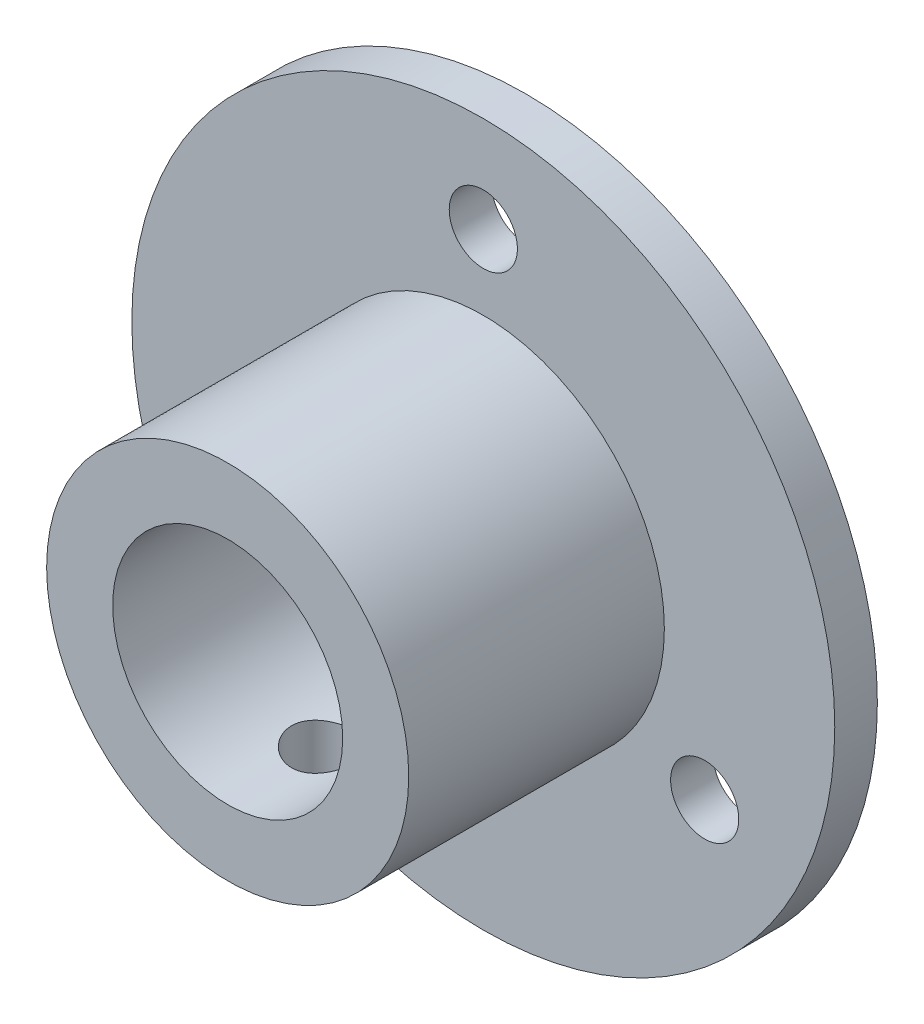
ISO-10303-21;
HEADER;
FILE_DESCRIPTION(('STEP AP214'),'2;1');
FILE_NAME('part.step','',(''),(''),'','','');
FILE_SCHEMA(('AUTOMOTIVE_DESIGN { 1 0 10303 214 1 1 1 1 }'));
ENDSEC;
DATA;
#1=APPLICATION_CONTEXT('core data for automotive mechanical design processes');
#2=APPLICATION_PROTOCOL_DEFINITION('international standard','automotive_design',2000,#1);
#3=PRODUCT_CONTEXT('',#1,'mechanical');
#4=PRODUCT('Part','Part','',(#3));
#5=PRODUCT_RELATED_PRODUCT_CATEGORY('part','',(#4));
#6=PRODUCT_DEFINITION_FORMATION('','',#4);
#7=PRODUCT_DEFINITION_CONTEXT('part definition',#1,'design');
#8=PRODUCT_DEFINITION('design','',#6,#7);
#9=PRODUCT_DEFINITION_SHAPE('','',#8);
#10=(LENGTH_UNIT() NAMED_UNIT(*) SI_UNIT(.MILLI.,.METRE.));
#11=(NAMED_UNIT(*) PLANE_ANGLE_UNIT() SI_UNIT($,.RADIAN.));
#12=(NAMED_UNIT(*) SI_UNIT($,.STERADIAN.) SOLID_ANGLE_UNIT());
#13=UNCERTAINTY_MEASURE_WITH_UNIT(LENGTH_MEASURE(1.E-05),#10,'distance_accuracy_value','');
#14=(GEOMETRIC_REPRESENTATION_CONTEXT(3) GLOBAL_UNCERTAINTY_ASSIGNED_CONTEXT((#13)) GLOBAL_UNIT_ASSIGNED_CONTEXT((#10,
#11,#12)) REPRESENTATION_CONTEXT('',''));
#15=CARTESIAN_POINT('',(0.,0.,0.));
#16=DIRECTION('',(0.,0.,1.));
#17=DIRECTION('',(1.,0.,0.));
#18=AXIS2_PLACEMENT_3D('',#15,#16,#17);
#19=CARTESIAN_POINT('',(0.,0.,2.));
#20=DIRECTION('',(0.,0.,1.));
#21=DIRECTION('',(1.,0.,0.));
#22=AXIS2_PLACEMENT_3D('',#19,#20,#21);
#23=PLANE('',#22);
#24=CARTESIAN_POINT('',(10.3923048454128,-6.0000000000003,2.));
#25=DIRECTION('',(0.,0.,1.));
#26=DIRECTION('',(1.,0.,0.));
#27=AXIS2_PLACEMENT_3D('',#24,#25,#26);
#28=CIRCLE('',#27,1.60000000000068);
#29=CARTESIAN_POINT('',(8.79230484541207,-6.0000000000003,1.99999999999999));
#30=VERTEX_POINT('',#29);
#31=EDGE_CURVE('E74',#30,#30,#28,.T.);
#32=ORIENTED_EDGE('',*,*,#31,.F.);
#33=EDGE_LOOP('',(#32));
#34=FACE_BOUND('',#33,.T.);
#35=CARTESIAN_POINT('',(-10.3923048454138,-5.9999999999997,2.));
#36=DIRECTION('',(0.,0.,1.));
#37=DIRECTION('',(1.,0.,0.));
#38=AXIS2_PLACEMENT_3D('',#35,#36,#37);
#39=CIRCLE('',#38,1.60000000000047);
#40=CARTESIAN_POINT('',(-11.9923048454142,-5.9999999999997,1.99999999999999));
#41=VERTEX_POINT('',#40);
#42=EDGE_CURVE('E68',#41,#41,#39,.T.);
#43=ORIENTED_EDGE('',*,*,#42,.F.);
#44=EDGE_LOOP('',(#43));
#45=FACE_BOUND('',#44,.T.);
#46=CARTESIAN_POINT('',(0.,12.,2.));
#47=DIRECTION('',(0.,0.,1.));
#48=DIRECTION('',(1.,0.,0.));
#49=AXIS2_PLACEMENT_3D('',#46,#47,#48);
#50=CIRCLE('',#49,1.6);
#51=CARTESIAN_POINT('',(-1.6,12.,1.99999999999999));
#52=VERTEX_POINT('',#51);
#53=EDGE_CURVE('E62',#52,#52,#50,.T.);
#54=ORIENTED_EDGE('',*,*,#53,.F.);
#55=EDGE_LOOP('',(#54));
#56=FACE_BOUND('',#55,.T.);
#57=CARTESIAN_POINT('',(0.,0.,2.));
#58=DIRECTION('',(0.,0.,1.));
#59=DIRECTION('',(1.,0.,0.));
#60=AXIS2_PLACEMENT_3D('',#57,#58,#59);
#61=CIRCLE('',#60,16.5);
#62=CARTESIAN_POINT('',(16.5,0.,2.));
#63=VERTEX_POINT('',#62);
#64=EDGE_CURVE('E10',#63,#63,#61,.T.);
#65=ORIENTED_EDGE('',*,*,#64,.T.);
#66=EDGE_LOOP('',(#65));
#67=FACE_BOUND('',#66,.T.);
#68=CARTESIAN_POINT('',(0.,0.,2.));
#69=DIRECTION('',(0.,0.,1.));
#70=DIRECTION('',(1.,0.,0.));
#71=AXIS2_PLACEMENT_3D('',#68,#69,#70);
#72=CIRCLE('',#71,8.5);
#73=CARTESIAN_POINT('',(8.5,0.,2.));
#74=VERTEX_POINT('',#73);
#75=EDGE_CURVE('E51',#74,#74,#72,.T.);
#76=ORIENTED_EDGE('',*,*,#75,.F.);
#77=EDGE_LOOP('',(#76));
#78=FACE_BOUND('',#77,.T.);
#79=ADVANCED_FACE('F32',(#34,#45,#56,#67,#78),#23,.T.);
#80=CARTESIAN_POINT('',(0.,0.,2.));
#81=DIRECTION('',(0.,0.,-1.));
#82=DIRECTION('',(-1.,0.,0.));
#83=AXIS2_PLACEMENT_3D('',#80,#81,#82);
#84=CYLINDRICAL_SURFACE('',#83,16.5);
#85=ORIENTED_EDGE('',*,*,#64,.F.);
#86=EDGE_LOOP('',(#85));
#87=FACE_BOUND('',#86,.T.);
#88=CARTESIAN_POINT('',(0.,0.,0.));
#89=DIRECTION('',(0.,0.,1.));
#90=DIRECTION('',(1.,0.,0.));
#91=AXIS2_PLACEMENT_3D('',#88,#89,#90);
#92=CIRCLE('',#91,16.5);
#93=CARTESIAN_POINT('',(16.5,0.,0.));
#94=VERTEX_POINT('',#93);
#95=EDGE_CURVE('E44',#94,#94,#92,.T.);
#96=ORIENTED_EDGE('',*,*,#95,.T.);
#97=EDGE_LOOP('',(#96));
#98=FACE_BOUND('',#97,.T.);
#99=ADVANCED_FACE('F34',(#87,#98),#84,.T.);
#100=CARTESIAN_POINT('',(0.,0.,0.));
#101=DIRECTION('',(0.,0.,1.));
#102=DIRECTION('',(1.,0.,0.));
#103=AXIS2_PLACEMENT_3D('',#100,#101,#102);
#104=PLANE('',#103);
#105=CARTESIAN_POINT('',(10.3923048454128,-6.0000000000003,0.));
#106=DIRECTION('',(0.,0.,-1.));
#107=DIRECTION('',(-1.,0.,0.));
#108=AXIS2_PLACEMENT_3D('',#105,#106,#107);
#109=CIRCLE('',#108,1.60000000000068);
#110=CARTESIAN_POINT('',(8.79230484541207,-6.0000000000003,0.));
#111=VERTEX_POINT('',#110);
#112=EDGE_CURVE('E77',#111,#111,#109,.T.);
#113=ORIENTED_EDGE('',*,*,#112,.F.);
#114=EDGE_LOOP('',(#113));
#115=FACE_BOUND('',#114,.T.);
#116=CARTESIAN_POINT('',(-10.3923048454138,-5.9999999999997,0.));
#117=DIRECTION('',(0.,0.,-1.));
#118=DIRECTION('',(-1.,0.,0.));
#119=AXIS2_PLACEMENT_3D('',#116,#117,#118);
#120=CIRCLE('',#119,1.60000000000047);
#121=CARTESIAN_POINT('',(-11.9923048454142,-5.9999999999997,0.));
#122=VERTEX_POINT('',#121);
#123=EDGE_CURVE('E71',#122,#122,#120,.T.);
#124=ORIENTED_EDGE('',*,*,#123,.F.);
#125=EDGE_LOOP('',(#124));
#126=FACE_BOUND('',#125,.T.);
#127=CARTESIAN_POINT('',(0.,12.,0.));
#128=DIRECTION('',(0.,0.,-1.));
#129=DIRECTION('',(-1.,0.,0.));
#130=AXIS2_PLACEMENT_3D('',#127,#128,#129);
#131=CIRCLE('',#130,1.6);
#132=CARTESIAN_POINT('',(-1.6,12.,0.));
#133=VERTEX_POINT('',#132);
#134=EDGE_CURVE('E65',#133,#133,#131,.T.);
#135=ORIENTED_EDGE('',*,*,#134,.F.);
#136=EDGE_LOOP('',(#135));
#137=FACE_BOUND('',#136,.T.);
#138=CARTESIAN_POINT('',(0.,0.,0.));
#139=DIRECTION('',(0.,0.,1.));
#140=DIRECTION('',(1.,0.,0.));
#141=AXIS2_PLACEMENT_3D('',#138,#139,#140);
#142=CIRCLE('',#141,5.4);
#143=CARTESIAN_POINT('',(5.4,0.,0.));
#144=VERTEX_POINT('',#143);
#145=EDGE_CURVE('E54',#144,#144,#142,.T.);
#146=ORIENTED_EDGE('',*,*,#145,.T.);
#147=EDGE_LOOP('',(#146));
#148=FACE_BOUND('',#147,.T.);
#149=ORIENTED_EDGE('',*,*,#95,.F.);
#150=EDGE_LOOP('',(#149));
#151=FACE_BOUND('',#150,.T.);
#152=ADVANCED_FACE('F116',(#115,#126,#137,#148,#151),#104,.F.);
#153=CARTESIAN_POINT('',(0.,0.,14.));
#154=DIRECTION('',(0.,0.,-1.));
#155=DIRECTION('',(-1.,0.,0.));
#156=AXIS2_PLACEMENT_3D('',#153,#154,#155);
#157=CYLINDRICAL_SURFACE('',#156,8.5);
#158=CARTESIAN_POINT('',(0.,-8.5,11.));
#159=CARTESIAN_POINT('',(0.0835602073116834,-8.49999852465812,10.9999967178691));
#160=CARTESIAN_POINT('',(0.167164170899166,-8.49875504437695,10.9929941000996));
#161=CARTESIAN_POINT('',(0.33202220467292,-8.49391434547826,10.9651832068583));
#162=CARTESIAN_POINT('',(0.413274128543538,-8.49031504366607,10.9443627123521));
#163=CARTESIAN_POINT('',(0.571019510053261,-8.4811659180518,10.8895684867067));
#164=CARTESIAN_POINT('',(0.647516980962108,-8.47561776634703,10.8556060287344));
#165=CARTESIAN_POINT('',(0.79371930055972,-8.4631790616307,10.7755226227247));
#166=CARTESIAN_POINT('',(0.863424820850616,-8.45628864154791,10.7294028784994));
#167=CARTESIAN_POINT('',(0.994816516549548,-8.44184556474541,10.6257913291527));
#168=CARTESIAN_POINT('',(1.05641975336287,-8.43428721228608,10.5681951309753));
#169=CARTESIAN_POINT('',(1.1691412650637,-8.41940313016037,10.4434902702093));
#170=CARTESIAN_POINT('',(1.22025883768728,-8.4120774161024,10.3763809710018));
#171=CARTESIAN_POINT('',(1.31089615224234,-8.39843282674878,10.2339776053288));
#172=CARTESIAN_POINT('',(1.35033279728853,-8.39212130489153,10.1586298828119));
#173=CARTESIAN_POINT('',(1.41595715270317,-8.38129933378097,10.0022490569533));
#174=CARTESIAN_POINT('',(1.44214587005801,-8.37678874764249,9.92121638626272));
#175=CARTESIAN_POINT('',(1.48026740658905,-8.37013636121934,9.75664894310292));
#176=CARTESIAN_POINT('',(1.49234409471487,-8.36797067223513,9.67314848174711));
#177=CARTESIAN_POINT('',(1.50234505486158,-8.36618114129228,9.50528048894824));
#178=CARTESIAN_POINT('',(1.50027044993802,-8.36655709762705,9.42091302684149));
#179=CARTESIAN_POINT('',(1.48214465879202,-8.36978659532625,9.25473986745596));
#180=CARTESIAN_POINT('',(1.46625598617925,-8.37261132730481,9.17291580162267));
#181=CARTESIAN_POINT('',(1.42120852873224,-8.38037493445764,9.01311326819002));
#182=CARTESIAN_POINT('',(1.39204923880641,-8.38531389010072,8.93513494708836));
#183=CARTESIAN_POINT('',(1.32112618145376,-8.39678011228507,8.78475593979735));
#184=CARTESIAN_POINT('',(1.27929578300233,-8.40331573888177,8.71238734241572));
#185=CARTESIAN_POINT('',(1.18426514162452,-8.41723322878402,8.575634979316));
#186=CARTESIAN_POINT('',(1.13106387280683,-8.42461516841691,8.5112519348913));
#187=CARTESIAN_POINT('',(1.01392044402847,-8.43951963661095,8.39135835341984));
#188=CARTESIAN_POINT('',(0.949839043227182,-8.44704269154381,8.33598383870425));
#189=CARTESIAN_POINT('',(0.813223017047741,-8.46128697681384,8.23675182224637));
#190=CARTESIAN_POINT('',(0.740688324257969,-8.46800820075587,8.19289441235745));
#191=CARTESIAN_POINT('',(0.589090433497639,-8.47990283414647,8.11792570133133));
#192=CARTESIAN_POINT('',(0.510020681297824,-8.48507466502145,8.08682738775337));
#193=CARTESIAN_POINT('',(0.347668482380527,-8.49327535201155,8.03839100335812));
#194=CARTESIAN_POINT('',(0.264386432134315,-8.49630440940878,8.02105164007076));
#195=CARTESIAN_POINT('',(0.097145111619168,-8.49985092576813,8.00081200141636));
#196=CARTESIAN_POINT('',(0.0132090843615061,-8.50040083433622,7.99772516159403));
#197=CARTESIAN_POINT('',(-0.153980271251544,-8.49901631664242,8.00557941294352));
#198=CARTESIAN_POINT('',(-0.237233629020517,-8.49708199798832,8.01651989650209));
#199=CARTESIAN_POINT('',(-0.400111048540306,-8.49096650695861,8.05196307734012));
#200=CARTESIAN_POINT('',(-0.47975604295781,-8.48680079660993,8.07637247882884));
#201=CARTESIAN_POINT('',(-0.633823333081784,-8.47668767054273,8.13796046041181));
#202=CARTESIAN_POINT('',(-0.708245306379777,-8.47074014495488,8.17513982794152));
#203=CARTESIAN_POINT('',(-0.850557919353285,-8.45764232694309,8.2616330721365));
#204=CARTESIAN_POINT('',(-0.918377380876572,-8.45048081539685,8.31106232996767));
#205=CARTESIAN_POINT('',(-1.04482575376698,-8.43578086254215,8.42049471234006));
#206=CARTESIAN_POINT('',(-1.10345391044434,-8.42824239034875,8.48049870430486));
#207=CARTESIAN_POINT('',(-1.21055495751759,-8.41353196779635,8.61021768885172));
#208=CARTESIAN_POINT('',(-1.25890120329949,-8.40636532837837,8.68003794375939));
#209=CARTESIAN_POINT('',(-1.34317887649159,-8.39331262284436,8.82691843383292));
#210=CARTESIAN_POINT('',(-1.37911073038509,-8.38742651273966,8.90397842016975));
#211=CARTESIAN_POINT('',(-1.43735470236499,-8.37764200573802,9.06281171816086));
#212=CARTESIAN_POINT('',(-1.45972757437841,-8.3737347552807,9.14456218099255));
#213=CARTESIAN_POINT('',(-1.49040804698522,-8.36832903130758,9.31073623477485));
#214=CARTESIAN_POINT('',(-1.4987170345307,-8.36683032026719,9.39515956129642));
#215=CARTESIAN_POINT('',(-1.50099164151106,-8.36642243845549,9.5630165247977));
#216=CARTESIAN_POINT('',(-1.49515678461176,-8.36747724556747,9.64644743680323));
#217=CARTESIAN_POINT('',(-1.46974322873663,-8.37197817944576,9.81111994714207));
#218=CARTESIAN_POINT('',(-1.45016459057914,-8.37542429563016,9.89236155516174));
#219=CARTESIAN_POINT('',(-1.39789926667029,-8.38430518558531,10.0502583454523));
#220=CARTESIAN_POINT('',(-1.36523178909751,-8.38973704421377,10.1269200602094));
#221=CARTESIAN_POINT('',(-1.2877371522897,-8.40197983656061,10.273706869482));
#222=CARTESIAN_POINT('',(-1.24290927156669,-8.40879085209956,10.3438315758188));
#223=CARTESIAN_POINT('',(-1.1416626166475,-8.42313765215559,10.4765579765985));
#224=CARTESIAN_POINT('',(-1.0850977566265,-8.43068186379938,10.5390473401217));
#225=CARTESIAN_POINT('',(-0.962289483399126,-8.44557973306429,10.6537147284838));
#226=CARTESIAN_POINT('',(-0.896043845959504,-8.45293334643561,10.7058903771682));
#227=CARTESIAN_POINT('',(-0.755134398648691,-8.46668871310451,10.7988273439279));
#228=CARTESIAN_POINT('',(-0.680408643630284,-8.47308254914894,10.8394959359709));
#229=CARTESIAN_POINT('',(-0.525100290133699,-8.4841208835999,10.9076386132623));
#230=CARTESIAN_POINT('',(-0.444523462097547,-8.48876707834471,10.9351255004232));
#231=CARTESIAN_POINT('',(-0.303055940544957,-8.49480295232011,10.9703330912887));
#232=CARTESIAN_POINT('',(-0.243008531002893,-8.49674116179219,10.9814398263959));
#233=CARTESIAN_POINT('',(-0.121981841577228,-8.4993402109253,10.9962744023258));
#234=CARTESIAN_POINT('',(-0.0610025810358458,-8.50000107706366,11.0000023960981));
#235=CARTESIAN_POINT('',(0.,-8.5,11.));
#236=B_SPLINE_CURVE_WITH_KNOTS('',3,(#158,#159,#160,#161,#162,#163,#164,#165,#166,#167,#168,
#169,#170,#171,#172,#173,#174,#175,#176,#177,#178,#179,#180,#181,#182,#183,#184,#185,#186,#187,
#188,#189,#190,#191,#192,#193,#194,#195,#196,#197,#198,#199,#200,#201,#202,#203,#204,#205,#206,
#207,#208,#209,#210,#211,#212,#213,#214,#215,#216,#217,#218,#219,#220,#221,#222,#223,#224,#225,
#226,#227,#228,#229,#230,#231,#232,#233,#234,#235),.UNSPECIFIED.,.T.,.F.,(4,2,2,2,2,2,2,2,2,2,2,
2,2,2,2,2,2,2,2,2,2,2,2,2,2,2,2,2,2,2,2,2,2,2,2,2,2,2,4),(0.,0.250457591265239,
0.501136955741325,0.751601762620912,1.0020417778349,1.2548734023472,1.50772195440904,
1.76232827341925,2.01691523667498,2.26888345171767,2.52083167063642,2.76985538403527,
3.01888857629236,3.26925473797252,3.51964349748054,3.7735186488756,4.02739582496181,
4.28153078678122,4.53564187317985,4.78641705372855,5.03718137196445,5.2862301259127,
5.53529423973253,5.78679991739404,6.0383262351567,6.29279109855223,6.54724721920708,
6.80055459873066,7.05383699613264,7.30356724592812,7.55329639063616,7.80266038647827,
8.05203918055447,8.30473127243322,8.55748151381616,8.81221395085161,9.06669849128299,
9.24954720252122,9.43239212355177),.UNSPECIFIED.);
#237=CARTESIAN_POINT('',(0.,-8.5,11.));
#238=VERTEX_POINT('',#237);
#239=EDGE_CURVE('E80',#238,#238,#236,.T.);
#240=ORIENTED_EDGE('',*,*,#239,.T.);
#241=EDGE_LOOP('',(#240));
#242=FACE_BOUND('',#241,.T.);
#243=CARTESIAN_POINT('',(0.,0.,14.));
#244=DIRECTION('',(0.,0.,1.));
#245=DIRECTION('',(1.,0.,0.));
#246=AXIS2_PLACEMENT_3D('',#243,#244,#245);
#247=CIRCLE('',#246,8.5);
#248=CARTESIAN_POINT('',(8.5,0.,14.));
#249=VERTEX_POINT('',#248);
#250=EDGE_CURVE('E49',#249,#249,#247,.T.);
#251=ORIENTED_EDGE('',*,*,#250,.F.);
#252=EDGE_LOOP('',(#251));
#253=FACE_BOUND('',#252,.T.);
#254=ORIENTED_EDGE('',*,*,#75,.T.);
#255=EDGE_LOOP('',(#254));
#256=FACE_BOUND('',#255,.T.);
#257=ADVANCED_FACE('F85',(#242,#253,#256),#157,.T.);
#258=CARTESIAN_POINT('',(0.,0.,14.));
#259=DIRECTION('',(0.,0.,1.));
#260=DIRECTION('',(1.,0.,0.));
#261=AXIS2_PLACEMENT_3D('',#258,#259,#260);
#262=PLANE('',#261);
#263=CARTESIAN_POINT('',(0.,0.,14.));
#264=DIRECTION('',(0.,0.,1.));
#265=DIRECTION('',(1.,0.,0.));
#266=AXIS2_PLACEMENT_3D('',#263,#264,#265);
#267=CIRCLE('',#266,5.4);
#268=CARTESIAN_POINT('',(5.4,0.,14.));
#269=VERTEX_POINT('',#268);
#270=EDGE_CURVE('E59',#269,#269,#267,.T.);
#271=ORIENTED_EDGE('',*,*,#270,.F.);
#272=EDGE_LOOP('',(#271));
#273=FACE_BOUND('',#272,.T.);
#274=ORIENTED_EDGE('',*,*,#250,.T.);
#275=EDGE_LOOP('',(#274));
#276=FACE_BOUND('',#275,.T.);
#277=ADVANCED_FACE('F109',(#273,#276),#262,.T.);
#278=CARTESIAN_POINT('',(0.,0.,-15.));
#279=DIRECTION('',(0.,0.,1.));
#280=DIRECTION('',(1.,0.,0.));
#281=AXIS2_PLACEMENT_3D('',#278,#279,#280);
#282=CYLINDRICAL_SURFACE('',#281,5.4);
#283=CARTESIAN_POINT('',(0.,-5.4,11.));
#284=CARTESIAN_POINT('',(-0.0825615010598151,-5.39999889620314,10.9999983204977));
#285=CARTESIAN_POINT('',(-0.165140548503201,-5.39808808904196,10.9931608162337));
#286=CARTESIAN_POINT('',(-0.327911371193086,-5.39065140237886,10.9660451260816));
#287=CARTESIAN_POINT('',(-0.408102124396127,-5.38512399779114,10.9457612699435));
#288=CARTESIAN_POINT('',(-0.563723939616361,-5.37106278473503,10.8924695367033));
#289=CARTESIAN_POINT('',(-0.639161268114802,-5.36253303637116,10.8594788375619));
#290=CARTESIAN_POINT('',(-0.783432834290128,-5.34336375098435,10.7817757924077));
#291=CARTESIAN_POINT('',(-0.852266484974763,-5.33272402666575,10.7370624056968));
#292=CARTESIAN_POINT('',(-0.983096141659102,-5.31018189380835,10.6360046793886));
#293=CARTESIAN_POINT('',(-1.04490373537014,-5.29825648347858,10.5794215523751));
#294=CARTESIAN_POINT('',(-1.15828582283563,-5.27463128541284,10.4567404674539));
#295=CARTESIAN_POINT('',(-1.20985887701474,-5.26293152962575,10.390641173269));
#296=CARTESIAN_POINT('',(-1.30224970296378,-5.24084453151262,10.2492712878456));
#297=CARTESIAN_POINT('',(-1.34284649937368,-5.2304861752692,10.1738513498703));
#298=CARTESIAN_POINT('',(-1.41070748557405,-5.21259480978224,10.0169216988291));
#299=CARTESIAN_POINT('',(-1.43797436803628,-5.2050612299994,9.93541321949997));
#300=CARTESIAN_POINT('',(-1.47773909241615,-5.19391059741305,9.77071665337665));
#301=CARTESIAN_POINT('',(-1.49058044284924,-5.19020263092727,9.68761781405185));
#302=CARTESIAN_POINT('',(-1.50220112493309,-5.1868517915112,9.52036893734877));
#303=CARTESIAN_POINT('',(-1.50098332832776,-5.18720808840779,9.43621911815307));
#304=CARTESIAN_POINT('',(-1.48479205605216,-5.19186440190074,9.27197326553114));
#305=CARTESIAN_POINT('',(-1.47023882724825,-5.19604392809897,9.19183183820411));
#306=CARTESIAN_POINT('',(-1.42846477442267,-5.20768220456576,9.03517564569052));
#307=CARTESIAN_POINT('',(-1.40124286148584,-5.21514123671562,8.95866119287741));
#308=CARTESIAN_POINT('',(-1.33457247761364,-5.23260083732974,8.81035732225355));
#309=CARTESIAN_POINT('',(-1.29498026204391,-5.24263102320792,8.7386361598279));
#310=CARTESIAN_POINT('',(-1.20479328815561,-5.26408740820604,8.60271010929054));
#311=CARTESIAN_POINT('',(-1.15419619954872,-5.27551390277027,8.53850681752865));
#312=CARTESIAN_POINT('',(-1.04130673234133,-5.2989728655235,8.41704334347629));
#313=CARTESIAN_POINT('',(-0.978662735642828,-5.31101244045391,8.36011083814418));
#314=CARTESIAN_POINT('',(-0.844567928641241,-5.33397839772952,8.25748912306663));
#315=CARTESIAN_POINT('',(-0.773116710506358,-5.34490472848142,8.21180043427703));
#316=CARTESIAN_POINT('',(-0.622900115205738,-5.36449007655318,8.13280182124391));
#317=CARTESIAN_POINT('',(-0.544099674897297,-5.37313738374641,8.09955547527331));
#318=CARTESIAN_POINT('',(-0.381731986523658,-5.38710591001732,8.04687908187036));
#319=CARTESIAN_POINT('',(-0.298165876945357,-5.39242791988439,8.02744574941212));
#320=CARTESIAN_POINT('',(-0.13143192925577,-5.39902483780091,8.00347143586523));
#321=CARTESIAN_POINT('',(-0.0483327670304173,-5.40042064588836,7.9984854261114));
#322=CARTESIAN_POINT('',(0.117515916763881,-5.39935776351791,8.00231239795091));
#323=CARTESIAN_POINT('',(0.200265476741422,-5.39689950813801,8.01112382197766));
#324=CARTESIAN_POINT('',(0.361448296165032,-5.38848318070834,8.04193200094356));
#325=CARTESIAN_POINT('',(0.43993354579664,-5.38259204601097,8.06367673406903));
#326=CARTESIAN_POINT('',(0.592131741742465,-5.36798195003225,8.11943824116572));
#327=CARTESIAN_POINT('',(0.665844148766858,-5.35926266986156,8.15345639908341));
#328=CARTESIAN_POINT('',(0.8081041684865,-5.3396848834101,8.23359905365579));
#329=CARTESIAN_POINT('',(0.87651247434425,-5.32878565608678,8.2799606291872));
#330=CARTESIAN_POINT('',(1.0047332047044,-5.30610572553855,8.38317936296896));
#331=CARTESIAN_POINT('',(1.06454377755765,-5.29432483326227,8.44003877607892));
#332=CARTESIAN_POINT('',(1.17577443233394,-5.27075811221255,8.56472173265402));
#333=CARTESIAN_POINT('',(1.22687949462459,-5.25898329849552,8.63282894186908));
#334=CARTESIAN_POINT('',(1.3169469771481,-5.2371563196512,8.77690476545568));
#335=CARTESIAN_POINT('',(1.35590986178956,-5.22710408864596,8.85287307901112));
#336=CARTESIAN_POINT('',(1.42029727000984,-5.20997758747408,9.01016860385981));
#337=CARTESIAN_POINT('',(1.44579692981739,-5.20288683715248,9.09146316530557));
#338=CARTESIAN_POINT('',(1.48269182994428,-5.1924945227134,9.25741965130012));
#339=CARTESIAN_POINT('',(1.49409105487888,-5.18919188813864,9.34208061755974));
#340=CARTESIAN_POINT('',(1.50221831969186,-5.1868444599585,9.50912693538894));
#341=CARTESIAN_POINT('',(1.49945485217498,-5.18765208553412,9.59148582801433));
#342=CARTESIAN_POINT('',(1.4805257194471,-5.19308564462548,9.75451387255362));
#343=CARTESIAN_POINT('',(1.46436045659293,-5.1977114635091,9.83518307512188));
#344=CARTESIAN_POINT('',(1.41939269098337,-5.21016862569603,9.99184068070168));
#345=CARTESIAN_POINT('',(1.39070657569341,-5.2179704029593,10.0678650111773));
#346=CARTESIAN_POINT('',(1.32160142004881,-5.23589899262465,10.2140809070088));
#347=CARTESIAN_POINT('',(1.28118040030426,-5.24602619720885,10.2842714857828));
#348=CARTESIAN_POINT('',(1.18824835442517,-5.26786572942455,10.4192331833902));
#349=CARTESIAN_POINT('',(1.13539450121552,-5.27961814778714,10.4837617720193));
#350=CARTESIAN_POINT('',(1.0197378329408,-5.30316998291235,10.6031988464642));
#351=CARTESIAN_POINT('',(0.95693255475383,-5.31496941060373,10.6581049434692));
#352=CARTESIAN_POINT('',(0.821352278769459,-5.33762207497858,10.7580297638937));
#353=CARTESIAN_POINT('',(0.748375510718609,-5.3484460943135,10.8027819479728));
#354=CARTESIAN_POINT('',(0.59563437923141,-5.36759969880726,10.8793137671474));
#355=CARTESIAN_POINT('',(0.51587403621207,-5.37593074842403,10.9111010222972));
#356=CARTESIAN_POINT('',(0.363774580520041,-5.3881928979834,10.9570640968816));
#357=CARTESIAN_POINT('',(0.29203728260249,-5.39258694794226,10.9731257451114));
#358=CARTESIAN_POINT('',(0.146871150832091,-5.39849081971542,10.9945938149871));
#359=CARTESIAN_POINT('',(0.0734425176232984,-5.40000098188161,11.0000014939999));
#360=CARTESIAN_POINT('',(0.,-5.4,11.));
#361=B_SPLINE_CURVE_WITH_KNOTS('',3,(#283,#284,#285,#286,#287,#288,#289,#290,#291,#292,#293,
#294,#295,#296,#297,#298,#299,#300,#301,#302,#303,#304,#305,#306,#307,#308,#309,#310,#311,#312,
#313,#314,#315,#316,#317,#318,#319,#320,#321,#322,#323,#324,#325,#326,#327,#328,#329,#330,#331,
#332,#333,#334,#335,#336,#337,#338,#339,#340,#341,#342,#343,#344,#345,#346,#347,#348,#349,#350,
#351,#352,#353,#354,#355,#356,#357,#358,#359,#360),.UNSPECIFIED.,.T.,.F.,(4,2,2,2,2,2,2,2,2,2,2,
2,2,2,2,2,2,2,2,2,2,2,2,2,2,2,2,2,2,2,2,2,2,2,2,2,2,2,4),(0.,0.247415031719389,
0.494934463376713,0.742120449531425,0.989328387405518,1.24209149190317,1.49489012452794,
1.75245228388406,2.00996239360061,2.26120118329619,2.51238865546227,2.7559227959376,
2.99947787284238,3.24597552054041,3.49252541516464,3.74783392611048,4.00315426395029,
4.25976198768393,4.51630866425262,4.76486412711366,5.01339153303427,5.25722780978238,
5.501091590009,5.75002738666326,5.99901671526411,6.25567190048675,6.51231726807094,
6.7675147783002,7.02264015625974,7.26867119098423,7.51469483948312,7.75847872272484,
8.00230375023008,8.25386295933779,8.50548453053998,8.76309708706933,9.02055801451316,
9.2406718383529,9.46075968309975),.UNSPECIFIED.);
#362=CARTESIAN_POINT('',(0.,-5.4,11.));
#363=VERTEX_POINT('',#362);
#364=EDGE_CURVE('E36',#363,#363,#361,.T.);
#365=ORIENTED_EDGE('',*,*,#364,.T.);
#366=EDGE_LOOP('',(#365));
#367=FACE_BOUND('',#366,.T.);
#368=ORIENTED_EDGE('',*,*,#270,.T.);
#369=EDGE_LOOP('',(#368));
#370=FACE_BOUND('',#369,.T.);
#371=ORIENTED_EDGE('',*,*,#145,.F.);
#372=EDGE_LOOP('',(#371));
#373=FACE_BOUND('',#372,.T.);
#374=ADVANCED_FACE('F105',(#367,#370,#373),#282,.F.);
#375=CARTESIAN_POINT('',(0.,12.,29.));
#376=DIRECTION('',(0.,0.,-1.));
#377=DIRECTION('',(-1.,0.,0.));
#378=AXIS2_PLACEMENT_3D('',#375,#376,#377);
#379=CYLINDRICAL_SURFACE('',#378,1.6);
#380=CARTESIAN_POINT('',(-1.6,12.,1.99999999999999));
#381=CARTESIAN_POINT('',(-1.6,12.,1.97916666666666));
#382=CARTESIAN_POINT('',(-1.6,12.,1.95833333333333));
#383=CARTESIAN_POINT('',(-1.6,12.,1.91666666666666));
#384=CARTESIAN_POINT('',(-1.6,12.,1.89583333333333));
#385=CARTESIAN_POINT('',(-1.6,12.,1.85416666666666));
#386=CARTESIAN_POINT('',(-1.6,12.,1.83333333333333));
#387=CARTESIAN_POINT('',(-1.6,12.,1.79166666666666));
#388=CARTESIAN_POINT('',(-1.6,12.,1.77083333333333));
#389=CARTESIAN_POINT('',(-1.6,12.,1.72916666666666));
#390=CARTESIAN_POINT('',(-1.6,12.,1.70833333333333));
#391=CARTESIAN_POINT('',(-1.6,12.,1.66666666666666));
#392=CARTESIAN_POINT('',(-1.6,12.,1.64583333333333));
#393=CARTESIAN_POINT('',(-1.6,12.,1.60416666666666));
#394=CARTESIAN_POINT('',(-1.6,12.,1.58333333333333));
#395=CARTESIAN_POINT('',(-1.6,12.,1.54166666666666));
#396=CARTESIAN_POINT('',(-1.6,12.,1.52083333333333));
#397=CARTESIAN_POINT('',(-1.6,12.,1.47916666666666));
#398=CARTESIAN_POINT('',(-1.6,12.,1.45833333333333));
#399=CARTESIAN_POINT('',(-1.6,12.,1.41666666666666));
#400=CARTESIAN_POINT('',(-1.6,12.,1.39583333333333));
#401=CARTESIAN_POINT('',(-1.6,12.,1.35416666666666));
#402=CARTESIAN_POINT('',(-1.6,12.,1.33333333333333));
#403=CARTESIAN_POINT('',(-1.6,12.,1.29166666666666));
#404=CARTESIAN_POINT('',(-1.6,12.,1.27083333333333));
#405=CARTESIAN_POINT('',(-1.6,12.,1.22916666666666));
#406=CARTESIAN_POINT('',(-1.6,12.,1.20833333333333));
#407=CARTESIAN_POINT('',(-1.6,12.,1.16666666666666));
#408=CARTESIAN_POINT('',(-1.6,12.,1.14583333333333));
#409=CARTESIAN_POINT('',(-1.6,12.,1.10416666666666));
#410=CARTESIAN_POINT('',(-1.6,12.,1.08333333333333));
#411=CARTESIAN_POINT('',(-1.6,12.,1.04166666666666));
#412=CARTESIAN_POINT('',(-1.6,12.,1.02083333333333));
#413=CARTESIAN_POINT('',(-1.6,12.,0.979166666666664));
#414=CARTESIAN_POINT('',(-1.6,12.,0.958333333333331));
#415=CARTESIAN_POINT('',(-1.6,12.,0.916666666666664));
#416=CARTESIAN_POINT('',(-1.6,12.,0.895833333333331));
#417=CARTESIAN_POINT('',(-1.6,12.,0.854166666666664));
#418=CARTESIAN_POINT('',(-1.6,12.,0.833333333333331));
#419=CARTESIAN_POINT('',(-1.6,12.,0.791666666666664));
#420=CARTESIAN_POINT('',(-1.6,12.,0.77083333333333));
#421=CARTESIAN_POINT('',(-1.6,12.,0.729166666666664));
#422=CARTESIAN_POINT('',(-1.6,12.,0.70833333333333));
#423=CARTESIAN_POINT('',(-1.6,12.,0.666666666666664));
#424=CARTESIAN_POINT('',(-1.6,12.,0.64583333333333));
#425=CARTESIAN_POINT('',(-1.6,12.,0.604166666666664));
#426=CARTESIAN_POINT('',(-1.6,12.,0.58333333333333));
#427=CARTESIAN_POINT('',(-1.6,12.,0.541666666666665));
#428=CARTESIAN_POINT('',(-1.6,12.,0.520833333333333));
#429=CARTESIAN_POINT('',(-1.6,12.,0.479166666666667));
#430=CARTESIAN_POINT('',(-1.6,12.,0.458333333333334));
#431=CARTESIAN_POINT('',(-1.6,12.,0.416666666666667));
#432=CARTESIAN_POINT('',(-1.6,12.,0.395833333333334));
#433=CARTESIAN_POINT('',(-1.6,12.,0.354166666666667));
#434=CARTESIAN_POINT('',(-1.6,12.,0.333333333333334));
#435=CARTESIAN_POINT('',(-1.6,12.,0.291666666666667));
#436=CARTESIAN_POINT('',(-1.6,12.,0.270833333333334));
#437=CARTESIAN_POINT('',(-1.6,12.,0.229166666666667));
#438=CARTESIAN_POINT('',(-1.6,12.,0.208333333333334));
#439=CARTESIAN_POINT('',(-1.6,12.,0.166666666666667));
#440=CARTESIAN_POINT('',(-1.6,12.,0.145833333333333));
#441=CARTESIAN_POINT('',(-1.6,12.,0.104166666666667));
#442=CARTESIAN_POINT('',(-1.6,12.,0.0833333333333334));
#443=CARTESIAN_POINT('',(-1.6,12.,0.0416666666666667));
#444=CARTESIAN_POINT('',(-1.6,12.,0.0208333333333333));
#445=CARTESIAN_POINT('',(-1.6,12.,0.));
#446=B_SPLINE_CURVE_WITH_KNOTS('',3,(#380,#381,#382,#383,#384,#385,#386,#387,#388,#389,#390,
#391,#392,#393,#394,#395,#396,#397,#398,#399,#400,#401,#402,#403,#404,#405,#406,#407,#408,#409,
#410,#411,#412,#413,#414,#415,#416,#417,#418,#419,#420,#421,#422,#423,#424,#425,#426,#427,#428,
#429,#430,#431,#432,#433,#434,#435,#436,#437,#438,#439,#440,#441,#442,#443,#444,#445),
.UNSPECIFIED.,.F.,.F.,(4,2,2,2,2,2,2,2,2,2,2,2,2,2,2,2,2,2,2,2,2,2,2,2,2,2,2,2,2,2,2,2,4),(0.,
0.0625000000000001,0.125,0.1875,0.25,0.3125,0.375,0.4375,0.5,0.562499999999997,
0.624999999999997,0.687499999999997,0.749999999999997,0.812499999999997,0.874999999999997,
0.937499999999997,0.999999999999997,1.0625,1.125,1.1875,1.25,1.3125,1.375,1.4375,
1.49999999999999,1.56249999999999,1.62499999999999,1.68749999999999,1.74999999999999,
1.81249999999999,1.87499999999999,1.93749999999999,1.99999999999999),.UNSPECIFIED.);
#447=EDGE_CURVE('BSEAM102',#52,#133,#446,.T.);
#448=ORIENTED_EDGE('',*,*,#53,.T.);
#449=ORIENTED_EDGE('',*,*,#134,.T.);
#450=ORIENTED_EDGE('',*,*,#447,.T.);
#451=ORIENTED_EDGE('',*,*,#447,.F.);
#452=EDGE_LOOP('',(#448,#450,#449,#451));
#453=FACE_BOUND('',#452,.T.);
#454=ADVANCED_FACE('F102',(#453),#379,.F.);
#455=CARTESIAN_POINT('',(-10.3923048454138,-5.9999999999997,29.));
#456=DIRECTION('',(0.,0.,-1.));
#457=DIRECTION('',(-1.,0.,0.));
#458=AXIS2_PLACEMENT_3D('',#455,#456,#457);
#459=CYLINDRICAL_SURFACE('',#458,1.60000000000047);
#460=CARTESIAN_POINT('',(-11.9923048454142,-5.9999999999997,1.99999999999999));
#461=CARTESIAN_POINT('',(-11.9923048454142,-5.9999999999997,1.97916666666666));
#462=CARTESIAN_POINT('',(-11.9923048454142,-5.9999999999997,1.95833333333333));
#463=CARTESIAN_POINT('',(-11.9923048454142,-5.9999999999997,1.91666666666666));
#464=CARTESIAN_POINT('',(-11.9923048454142,-5.9999999999997,1.89583333333333));
#465=CARTESIAN_POINT('',(-11.9923048454142,-5.9999999999997,1.85416666666666));
#466=CARTESIAN_POINT('',(-11.9923048454142,-5.9999999999997,1.83333333333333));
#467=CARTESIAN_POINT('',(-11.9923048454142,-5.9999999999997,1.79166666666666));
#468=CARTESIAN_POINT('',(-11.9923048454142,-5.9999999999997,1.77083333333333));
#469=CARTESIAN_POINT('',(-11.9923048454142,-5.9999999999997,1.72916666666666));
#470=CARTESIAN_POINT('',(-11.9923048454142,-5.9999999999997,1.70833333333333));
#471=CARTESIAN_POINT('',(-11.9923048454142,-5.9999999999997,1.66666666666666));
#472=CARTESIAN_POINT('',(-11.9923048454142,-5.9999999999997,1.64583333333333));
#473=CARTESIAN_POINT('',(-11.9923048454142,-5.9999999999997,1.60416666666666));
#474=CARTESIAN_POINT('',(-11.9923048454142,-5.9999999999997,1.58333333333333));
#475=CARTESIAN_POINT('',(-11.9923048454142,-5.9999999999997,1.54166666666666));
#476=CARTESIAN_POINT('',(-11.9923048454142,-5.9999999999997,1.52083333333333));
#477=CARTESIAN_POINT('',(-11.9923048454142,-5.9999999999997,1.47916666666666));
#478=CARTESIAN_POINT('',(-11.9923048454142,-5.9999999999997,1.45833333333333));
#479=CARTESIAN_POINT('',(-11.9923048454142,-5.9999999999997,1.41666666666666));
#480=CARTESIAN_POINT('',(-11.9923048454142,-5.9999999999997,1.39583333333333));
#481=CARTESIAN_POINT('',(-11.9923048454142,-5.9999999999997,1.35416666666666));
#482=CARTESIAN_POINT('',(-11.9923048454142,-5.9999999999997,1.33333333333333));
#483=CARTESIAN_POINT('',(-11.9923048454142,-5.9999999999997,1.29166666666666));
#484=CARTESIAN_POINT('',(-11.9923048454142,-5.9999999999997,1.27083333333333));
#485=CARTESIAN_POINT('',(-11.9923048454142,-5.9999999999997,1.22916666666666));
#486=CARTESIAN_POINT('',(-11.9923048454142,-5.9999999999997,1.20833333333333));
#487=CARTESIAN_POINT('',(-11.9923048454142,-5.9999999999997,1.16666666666666));
#488=CARTESIAN_POINT('',(-11.9923048454142,-5.9999999999997,1.14583333333333));
#489=CARTESIAN_POINT('',(-11.9923048454142,-5.9999999999997,1.10416666666666));
#490=CARTESIAN_POINT('',(-11.9923048454142,-5.9999999999997,1.08333333333333));
#491=CARTESIAN_POINT('',(-11.9923048454142,-5.9999999999997,1.04166666666666));
#492=CARTESIAN_POINT('',(-11.9923048454142,-5.9999999999997,1.02083333333333));
#493=CARTESIAN_POINT('',(-11.9923048454142,-5.9999999999997,0.979166666666664));
#494=CARTESIAN_POINT('',(-11.9923048454142,-5.9999999999997,0.958333333333331));
#495=CARTESIAN_POINT('',(-11.9923048454142,-5.9999999999997,0.916666666666664));
#496=CARTESIAN_POINT('',(-11.9923048454142,-5.9999999999997,0.895833333333331));
#497=CARTESIAN_POINT('',(-11.9923048454142,-5.9999999999997,0.854166666666664));
#498=CARTESIAN_POINT('',(-11.9923048454142,-5.9999999999997,0.833333333333331));
#499=CARTESIAN_POINT('',(-11.9923048454142,-5.9999999999997,0.791666666666664));
#500=CARTESIAN_POINT('',(-11.9923048454142,-5.9999999999997,0.77083333333333));
#501=CARTESIAN_POINT('',(-11.9923048454142,-5.9999999999997,0.729166666666664));
#502=CARTESIAN_POINT('',(-11.9923048454142,-5.9999999999997,0.70833333333333));
#503=CARTESIAN_POINT('',(-11.9923048454142,-5.9999999999997,0.666666666666664));
#504=CARTESIAN_POINT('',(-11.9923048454142,-5.9999999999997,0.64583333333333));
#505=CARTESIAN_POINT('',(-11.9923048454142,-5.9999999999997,0.604166666666664));
#506=CARTESIAN_POINT('',(-11.9923048454142,-5.9999999999997,0.58333333333333));
#507=CARTESIAN_POINT('',(-11.9923048454142,-5.9999999999997,0.541666666666665));
#508=CARTESIAN_POINT('',(-11.9923048454142,-5.9999999999997,0.520833333333333));
#509=CARTESIAN_POINT('',(-11.9923048454142,-5.9999999999997,0.479166666666667));
#510=CARTESIAN_POINT('',(-11.9923048454142,-5.9999999999997,0.458333333333334));
#511=CARTESIAN_POINT('',(-11.9923048454142,-5.9999999999997,0.416666666666667));
#512=CARTESIAN_POINT('',(-11.9923048454142,-5.9999999999997,0.395833333333334));
#513=CARTESIAN_POINT('',(-11.9923048454142,-5.9999999999997,0.354166666666667));
#514=CARTESIAN_POINT('',(-11.9923048454142,-5.9999999999997,0.333333333333334));
#515=CARTESIAN_POINT('',(-11.9923048454142,-5.9999999999997,0.291666666666667));
#516=CARTESIAN_POINT('',(-11.9923048454142,-5.9999999999997,0.270833333333334));
#517=CARTESIAN_POINT('',(-11.9923048454142,-5.9999999999997,0.229166666666667));
#518=CARTESIAN_POINT('',(-11.9923048454142,-5.9999999999997,0.208333333333334));
#519=CARTESIAN_POINT('',(-11.9923048454142,-5.9999999999997,0.166666666666667));
#520=CARTESIAN_POINT('',(-11.9923048454142,-5.9999999999997,0.145833333333333));
#521=CARTESIAN_POINT('',(-11.9923048454142,-5.9999999999997,0.104166666666667));
#522=CARTESIAN_POINT('',(-11.9923048454142,-5.9999999999997,0.0833333333333334));
#523=CARTESIAN_POINT('',(-11.9923048454142,-5.9999999999997,0.0416666666666667));
#524=CARTESIAN_POINT('',(-11.9923048454142,-5.9999999999997,0.0208333333333333));
#525=CARTESIAN_POINT('',(-11.9923048454142,-5.9999999999997,0.));
#526=B_SPLINE_CURVE_WITH_KNOTS('',3,(#460,#461,#462,#463,#464,#465,#466,#467,#468,#469,#470,
#471,#472,#473,#474,#475,#476,#477,#478,#479,#480,#481,#482,#483,#484,#485,#486,#487,#488,#489,
#490,#491,#492,#493,#494,#495,#496,#497,#498,#499,#500,#501,#502,#503,#504,#505,#506,#507,#508,
#509,#510,#511,#512,#513,#514,#515,#516,#517,#518,#519,#520,#521,#522,#523,#524,#525),
.UNSPECIFIED.,.F.,.F.,(4,2,2,2,2,2,2,2,2,2,2,2,2,2,2,2,2,2,2,2,2,2,2,2,2,2,2,2,2,2,2,2,4),(0.,
0.0625000000000001,0.125,0.1875,0.25,0.3125,0.375,0.4375,0.5,0.562499999999997,
0.624999999999997,0.687499999999997,0.749999999999997,0.812499999999997,0.874999999999997,
0.937499999999997,0.999999999999997,1.0625,1.125,1.1875,1.25,1.3125,1.375,1.4375,
1.49999999999999,1.56249999999999,1.62499999999999,1.68749999999999,1.74999999999999,
1.81249999999999,1.87499999999999,1.93749999999999,1.99999999999999),.UNSPECIFIED.);
#527=EDGE_CURVE('BSEAM98',#41,#122,#526,.T.);
#528=ORIENTED_EDGE('',*,*,#42,.T.);
#529=ORIENTED_EDGE('',*,*,#123,.T.);
#530=ORIENTED_EDGE('',*,*,#527,.T.);
#531=ORIENTED_EDGE('',*,*,#527,.F.);
#532=EDGE_LOOP('',(#528,#530,#529,#531));
#533=FACE_BOUND('',#532,.T.);
#534=ADVANCED_FACE('F98',(#533),#459,.F.);
#535=CARTESIAN_POINT('',(10.3923048454128,-6.0000000000003,29.));
#536=DIRECTION('',(0.,0.,-1.));
#537=DIRECTION('',(-1.,0.,0.));
#538=AXIS2_PLACEMENT_3D('',#535,#536,#537);
#539=CYLINDRICAL_SURFACE('',#538,1.60000000000068);
#540=CARTESIAN_POINT('',(8.79230484541207,-6.0000000000003,1.99999999999999));
#541=CARTESIAN_POINT('',(8.79230484541207,-6.0000000000003,1.97916666666666));
#542=CARTESIAN_POINT('',(8.79230484541207,-6.0000000000003,1.95833333333333));
#543=CARTESIAN_POINT('',(8.79230484541207,-6.0000000000003,1.91666666666666));
#544=CARTESIAN_POINT('',(8.79230484541207,-6.0000000000003,1.89583333333333));
#545=CARTESIAN_POINT('',(8.79230484541207,-6.0000000000003,1.85416666666666));
#546=CARTESIAN_POINT('',(8.79230484541207,-6.0000000000003,1.83333333333333));
#547=CARTESIAN_POINT('',(8.79230484541207,-6.0000000000003,1.79166666666666));
#548=CARTESIAN_POINT('',(8.79230484541207,-6.0000000000003,1.77083333333333));
#549=CARTESIAN_POINT('',(8.79230484541207,-6.0000000000003,1.72916666666666));
#550=CARTESIAN_POINT('',(8.79230484541207,-6.0000000000003,1.70833333333333));
#551=CARTESIAN_POINT('',(8.79230484541207,-6.0000000000003,1.66666666666666));
#552=CARTESIAN_POINT('',(8.79230484541207,-6.0000000000003,1.64583333333333));
#553=CARTESIAN_POINT('',(8.79230484541207,-6.0000000000003,1.60416666666666));
#554=CARTESIAN_POINT('',(8.79230484541207,-6.0000000000003,1.58333333333333));
#555=CARTESIAN_POINT('',(8.79230484541207,-6.0000000000003,1.54166666666666));
#556=CARTESIAN_POINT('',(8.79230484541207,-6.0000000000003,1.52083333333333));
#557=CARTESIAN_POINT('',(8.79230484541207,-6.0000000000003,1.47916666666666));
#558=CARTESIAN_POINT('',(8.79230484541207,-6.0000000000003,1.45833333333333));
#559=CARTESIAN_POINT('',(8.79230484541207,-6.0000000000003,1.41666666666666));
#560=CARTESIAN_POINT('',(8.79230484541207,-6.0000000000003,1.39583333333333));
#561=CARTESIAN_POINT('',(8.79230484541207,-6.0000000000003,1.35416666666666));
#562=CARTESIAN_POINT('',(8.79230484541207,-6.0000000000003,1.33333333333333));
#563=CARTESIAN_POINT('',(8.79230484541207,-6.0000000000003,1.29166666666666));
#564=CARTESIAN_POINT('',(8.79230484541207,-6.0000000000003,1.27083333333333));
#565=CARTESIAN_POINT('',(8.79230484541207,-6.0000000000003,1.22916666666666));
#566=CARTESIAN_POINT('',(8.79230484541207,-6.0000000000003,1.20833333333333));
#567=CARTESIAN_POINT('',(8.79230484541207,-6.0000000000003,1.16666666666666));
#568=CARTESIAN_POINT('',(8.79230484541207,-6.0000000000003,1.14583333333333));
#569=CARTESIAN_POINT('',(8.79230484541207,-6.0000000000003,1.10416666666666));
#570=CARTESIAN_POINT('',(8.79230484541207,-6.0000000000003,1.08333333333333));
#571=CARTESIAN_POINT('',(8.79230484541207,-6.0000000000003,1.04166666666666));
#572=CARTESIAN_POINT('',(8.79230484541207,-6.0000000000003,1.02083333333333));
#573=CARTESIAN_POINT('',(8.79230484541207,-6.0000000000003,0.979166666666664));
#574=CARTESIAN_POINT('',(8.79230484541207,-6.0000000000003,0.958333333333331));
#575=CARTESIAN_POINT('',(8.79230484541207,-6.0000000000003,0.916666666666664));
#576=CARTESIAN_POINT('',(8.79230484541207,-6.0000000000003,0.895833333333331));
#577=CARTESIAN_POINT('',(8.79230484541207,-6.0000000000003,0.854166666666664));
#578=CARTESIAN_POINT('',(8.79230484541207,-6.0000000000003,0.833333333333331));
#579=CARTESIAN_POINT('',(8.79230484541207,-6.0000000000003,0.791666666666664));
#580=CARTESIAN_POINT('',(8.79230484541207,-6.0000000000003,0.77083333333333));
#581=CARTESIAN_POINT('',(8.79230484541207,-6.0000000000003,0.729166666666664));
#582=CARTESIAN_POINT('',(8.79230484541207,-6.0000000000003,0.70833333333333));
#583=CARTESIAN_POINT('',(8.79230484541207,-6.0000000000003,0.666666666666664));
#584=CARTESIAN_POINT('',(8.79230484541207,-6.0000000000003,0.64583333333333));
#585=CARTESIAN_POINT('',(8.79230484541207,-6.0000000000003,0.604166666666664));
#586=CARTESIAN_POINT('',(8.79230484541207,-6.0000000000003,0.58333333333333));
#587=CARTESIAN_POINT('',(8.79230484541207,-6.0000000000003,0.541666666666665));
#588=CARTESIAN_POINT('',(8.79230484541207,-6.0000000000003,0.520833333333333));
#589=CARTESIAN_POINT('',(8.79230484541207,-6.0000000000003,0.479166666666667));
#590=CARTESIAN_POINT('',(8.79230484541207,-6.0000000000003,0.458333333333334));
#591=CARTESIAN_POINT('',(8.79230484541207,-6.0000000000003,0.416666666666667));
#592=CARTESIAN_POINT('',(8.79230484541207,-6.0000000000003,0.395833333333334));
#593=CARTESIAN_POINT('',(8.79230484541207,-6.0000000000003,0.354166666666667));
#594=CARTESIAN_POINT('',(8.79230484541207,-6.0000000000003,0.333333333333334));
#595=CARTESIAN_POINT('',(8.79230484541207,-6.0000000000003,0.291666666666667));
#596=CARTESIAN_POINT('',(8.79230484541207,-6.0000000000003,0.270833333333334));
#597=CARTESIAN_POINT('',(8.79230484541207,-6.0000000000003,0.229166666666667));
#598=CARTESIAN_POINT('',(8.79230484541207,-6.0000000000003,0.208333333333334));
#599=CARTESIAN_POINT('',(8.79230484541207,-6.0000000000003,0.166666666666667));
#600=CARTESIAN_POINT('',(8.79230484541207,-6.0000000000003,0.145833333333333));
#601=CARTESIAN_POINT('',(8.79230484541207,-6.0000000000003,0.104166666666667));
#602=CARTESIAN_POINT('',(8.79230484541207,-6.0000000000003,0.0833333333333334));
#603=CARTESIAN_POINT('',(8.79230484541207,-6.0000000000003,0.0416666666666667));
#604=CARTESIAN_POINT('',(8.79230484541207,-6.0000000000003,0.0208333333333333));
#605=CARTESIAN_POINT('',(8.79230484541207,-6.0000000000003,0.));
#606=B_SPLINE_CURVE_WITH_KNOTS('',3,(#540,#541,#542,#543,#544,#545,#546,#547,#548,#549,#550,
#551,#552,#553,#554,#555,#556,#557,#558,#559,#560,#561,#562,#563,#564,#565,#566,#567,#568,#569,
#570,#571,#572,#573,#574,#575,#576,#577,#578,#579,#580,#581,#582,#583,#584,#585,#586,#587,#588,
#589,#590,#591,#592,#593,#594,#595,#596,#597,#598,#599,#600,#601,#602,#603,#604,#605),
.UNSPECIFIED.,.F.,.F.,(4,2,2,2,2,2,2,2,2,2,2,2,2,2,2,2,2,2,2,2,2,2,2,2,2,2,2,2,2,2,2,2,4),(0.,
0.0625000000000001,0.125,0.1875,0.25,0.3125,0.375,0.4375,0.5,0.562499999999997,
0.624999999999997,0.687499999999997,0.749999999999997,0.812499999999997,0.874999999999997,
0.937499999999997,0.999999999999997,1.0625,1.125,1.1875,1.25,1.3125,1.375,1.4375,
1.49999999999999,1.56249999999999,1.62499999999999,1.68749999999999,1.74999999999999,
1.81249999999999,1.87499999999999,1.93749999999999,1.99999999999999),.UNSPECIFIED.);
#607=EDGE_CURVE('BSEAM93',#30,#111,#606,.T.);
#608=ORIENTED_EDGE('',*,*,#31,.T.);
#609=ORIENTED_EDGE('',*,*,#112,.T.);
#610=ORIENTED_EDGE('',*,*,#607,.T.);
#611=ORIENTED_EDGE('',*,*,#607,.F.);
#612=EDGE_LOOP('',(#608,#610,#609,#611));
#613=FACE_BOUND('',#612,.T.);
#614=ADVANCED_FACE('F93',(#613),#539,.F.);
#615=CARTESIAN_POINT('',(0.,-12.,9.5));
#616=DIRECTION('',(0.,1.,0.));
#617=DIRECTION('',(0.,0.,1.));
#618=AXIS2_PLACEMENT_3D('',#615,#616,#617);
#619=CYLINDRICAL_SURFACE('',#618,1.5);
#620=ORIENTED_EDGE('',*,*,#364,.F.);
#621=EDGE_LOOP('',(#620));
#622=FACE_BOUND('',#621,.T.);
#623=ORIENTED_EDGE('',*,*,#239,.F.);
#624=EDGE_LOOP('',(#623));
#625=FACE_BOUND('',#624,.T.);
#626=ADVANCED_FACE('F89',(#622,#625),#619,.F.);
#627=CLOSED_SHELL('',(#79,#99,#152,#257,#277,#374,#454,#534,#614,#626));
#628=MANIFOLD_SOLID_BREP('B2',#627);
#629=ADVANCED_BREP_SHAPE_REPRESENTATION('',(#18,#628),#14);
#630=SHAPE_DEFINITION_REPRESENTATION(#9,#629);
ENDSEC;
END-ISO-10303-21;
